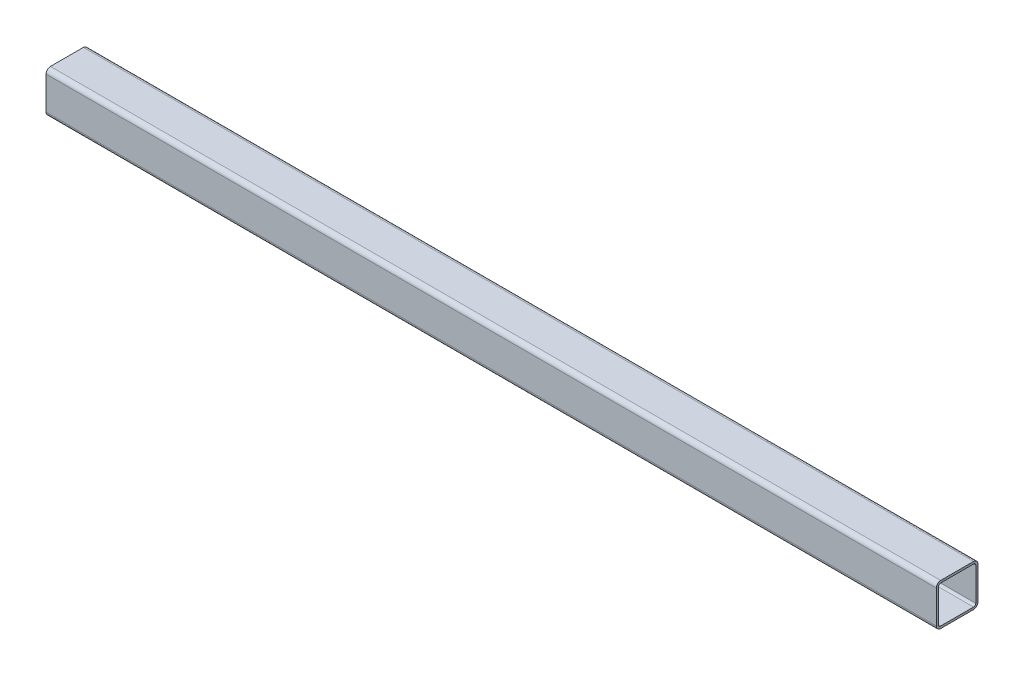
ISO-10303-21;
HEADER;
FILE_DESCRIPTION(('STEP AP214'),'2;1');
FILE_NAME('part.step','',(''),(''),'','','');
FILE_SCHEMA(('AUTOMOTIVE_DESIGN { 1 0 10303 214 1 1 1 1 }'));
ENDSEC;
DATA;
#1=APPLICATION_CONTEXT('core data for automotive mechanical design processes');
#2=APPLICATION_PROTOCOL_DEFINITION('international standard','automotive_design',2000,#1);
#3=PRODUCT_CONTEXT('',#1,'mechanical');
#4=PRODUCT('Part','Part','',(#3));
#5=PRODUCT_RELATED_PRODUCT_CATEGORY('part','',(#4));
#6=PRODUCT_DEFINITION_FORMATION('','',#4);
#7=PRODUCT_DEFINITION_CONTEXT('part definition',#1,'design');
#8=PRODUCT_DEFINITION('design','',#6,#7);
#9=PRODUCT_DEFINITION_SHAPE('','',#8);
#10=(LENGTH_UNIT() NAMED_UNIT(*) SI_UNIT(.MILLI.,.METRE.));
#11=(NAMED_UNIT(*) PLANE_ANGLE_UNIT() SI_UNIT($,.RADIAN.));
#12=(NAMED_UNIT(*) SI_UNIT($,.STERADIAN.) SOLID_ANGLE_UNIT());
#13=UNCERTAINTY_MEASURE_WITH_UNIT(LENGTH_MEASURE(1.E-05),#10,'distance_accuracy_value','');
#14=(GEOMETRIC_REPRESENTATION_CONTEXT(3) GLOBAL_UNCERTAINTY_ASSIGNED_CONTEXT((#13)) GLOBAL_UNIT_ASSIGNED_CONTEXT((#10,
#11,#12)) REPRESENTATION_CONTEXT('',''));
#15=CARTESIAN_POINT('',(0.,0.,0.));
#16=DIRECTION('',(0.,0.,1.));
#17=DIRECTION('',(1.,0.,0.));
#18=AXIS2_PLACEMENT_3D('',#15,#16,#17);
#19=CARTESIAN_POINT('',(670.,276.4,23.6));
#20=DIRECTION('',(-1.,0.,0.));
#21=DIRECTION('',(0.,-1.,0.));
#22=AXIS2_PLACEMENT_3D('',#19,#20,#21);
#23=CYLINDRICAL_SURFACE('',#22,3.19999999999993);
#24=CARTESIAN_POINT('',(-640.,276.4,23.6));
#25=DIRECTION('',(-1.,0.,0.));
#26=DIRECTION('',(0.,-1.,0.));
#27=AXIS2_PLACEMENT_3D('',#24,#25,#26);
#28=CIRCLE('',#27,3.19999999999993);
#29=CARTESIAN_POINT('',(-640.,276.4,26.7999999999999));
#30=VERTEX_POINT('',#29);
#31=CARTESIAN_POINT('',(-640.,273.2,23.6));
#32=VERTEX_POINT('',#31);
#33=EDGE_CURVE('E197',#30,#32,#28,.F.);
#34=ORIENTED_EDGE('',*,*,#33,.F.);
#35=DIRECTION('',(1.,0.,0.));
#36=VECTOR('',#35,1.);
#37=CARTESIAN_POINT('',(670.,276.4,26.7999999999999));
#38=LINE('',#37,#36);
#39=CARTESIAN_POINT('',(640.,276.4,26.7999999999999));
#40=VERTEX_POINT('',#39);
#41=EDGE_CURVE('E163',#40,#30,#38,.F.);
#42=ORIENTED_EDGE('',*,*,#41,.F.);
#43=CARTESIAN_POINT('',(640.,276.4,23.6));
#44=DIRECTION('',(-1.,0.,0.));
#45=DIRECTION('',(0.,-1.,0.));
#46=AXIS2_PLACEMENT_3D('',#43,#44,#45);
#47=CIRCLE('',#46,3.19999999999993);
#48=CARTESIAN_POINT('',(640.,273.2,23.6));
#49=VERTEX_POINT('',#48);
#50=EDGE_CURVE('E213',#49,#40,#47,.T.);
#51=ORIENTED_EDGE('',*,*,#50,.F.);
#52=DIRECTION('',(1.,0.,0.));
#53=VECTOR('',#52,1.);
#54=CARTESIAN_POINT('',(670.,273.2,23.6));
#55=LINE('',#54,#53);
#56=EDGE_CURVE('E173',#32,#49,#55,.T.);
#57=ORIENTED_EDGE('',*,*,#56,.F.);
#58=EDGE_LOOP('',(#34,#42,#51,#57));
#59=FACE_BOUND('',#58,.T.);
#60=ADVANCED_FACE('F16',(#59),#23,.F.);
#61=CARTESIAN_POINT('',(670.,273.2,23.6));
#62=DIRECTION('',(0.,1.,0.));
#63=DIRECTION('',(0.,0.,1.));
#64=AXIS2_PLACEMENT_3D('',#61,#62,#63);
#65=PLANE('',#64);
#66=ORIENTED_EDGE('',*,*,#56,.T.);
#67=DIRECTION('',(0.,0.,-1.));
#68=VECTOR('',#67,1.);
#69=CARTESIAN_POINT('',(640.,273.2,1170.));
#70=LINE('',#69,#68);
#71=CARTESIAN_POINT('',(640.,273.2,-23.6));
#72=VERTEX_POINT('',#71);
#73=EDGE_CURVE('E139',#72,#49,#70,.F.);
#74=ORIENTED_EDGE('',*,*,#73,.F.);
#75=DIRECTION('',(-1.,0.,0.));
#76=VECTOR('',#75,1.);
#77=CARTESIAN_POINT('',(670.,273.2,-23.6));
#78=LINE('',#77,#76);
#79=CARTESIAN_POINT('',(-640.,273.2,-23.6));
#80=VERTEX_POINT('',#79);
#81=EDGE_CURVE('E170',#72,#80,#78,.T.);
#82=ORIENTED_EDGE('',*,*,#81,.T.);
#83=DIRECTION('',(0.,0.,1.));
#84=VECTOR('',#83,1.);
#85=CARTESIAN_POINT('',(-640.,273.2,1170.));
#86=LINE('',#85,#84);
#87=EDGE_CURVE('E196',#32,#80,#86,.F.);
#88=ORIENTED_EDGE('',*,*,#87,.F.);
#89=EDGE_LOOP('',(#66,#74,#82,#88));
#90=FACE_BOUND('',#89,.T.);
#91=ADVANCED_FACE('F435',(#90),#65,.T.);
#92=CARTESIAN_POINT('',(670.,276.4,-23.6));
#93=DIRECTION('',(-1.,0.,0.));
#94=DIRECTION('',(0.,-1.,0.));
#95=AXIS2_PLACEMENT_3D('',#92,#93,#94);
#96=CYLINDRICAL_SURFACE('',#95,3.19999999999998);
#97=CARTESIAN_POINT('',(-640.,276.4,-23.6));
#98=DIRECTION('',(-1.,0.,0.));
#99=DIRECTION('',(0.,-1.,0.));
#100=AXIS2_PLACEMENT_3D('',#97,#98,#99);
#101=CIRCLE('',#100,3.19999999999998);
#102=CARTESIAN_POINT('',(-640.,276.4,-26.8000000000001));
#103=VERTEX_POINT('',#102);
#104=EDGE_CURVE('E194',#80,#103,#101,.F.);
#105=ORIENTED_EDGE('',*,*,#104,.F.);
#106=ORIENTED_EDGE('',*,*,#81,.F.);
#107=CARTESIAN_POINT('',(640.,276.4,-23.6));
#108=DIRECTION('',(-1.,0.,0.));
#109=DIRECTION('',(0.,-1.,0.));
#110=AXIS2_PLACEMENT_3D('',#107,#108,#109);
#111=CIRCLE('',#110,3.19999999999998);
#112=CARTESIAN_POINT('',(640.,276.4,-26.8000000000001));
#113=VERTEX_POINT('',#112);
#114=EDGE_CURVE('E137',#113,#72,#111,.T.);
#115=ORIENTED_EDGE('',*,*,#114,.F.);
#116=DIRECTION('',(1.,0.,0.));
#117=VECTOR('',#116,1.);
#118=CARTESIAN_POINT('',(670.,276.4,-26.8000000000001));
#119=LINE('',#118,#117);
#120=EDGE_CURVE('E124',#103,#113,#119,.T.);
#121=ORIENTED_EDGE('',*,*,#120,.F.);
#122=EDGE_LOOP('',(#105,#106,#115,#121));
#123=FACE_BOUND('',#122,.T.);
#124=ADVANCED_FACE('F426',(#123),#96,.F.);
#125=CARTESIAN_POINT('',(670.,323.6,-26.8));
#126=DIRECTION('',(0.,0.,1.));
#127=DIRECTION('',(0.,-1.,0.));
#128=AXIS2_PLACEMENT_3D('',#125,#126,#127);
#129=PLANE('',#128);
#130=ORIENTED_EDGE('',*,*,#120,.T.);
#131=DIRECTION('',(0.,1.,0.));
#132=VECTOR('',#131,1.);
#133=CARTESIAN_POINT('',(640.,276.4,-26.8000000000002));
#134=LINE('',#133,#132);
#135=CARTESIAN_POINT('',(640.,323.6,-26.8));
#136=VERTEX_POINT('',#135);
#137=EDGE_CURVE('E131',#136,#113,#134,.F.);
#138=ORIENTED_EDGE('',*,*,#137,.F.);
#139=DIRECTION('',(-1.,0.,0.));
#140=VECTOR('',#139,1.);
#141=CARTESIAN_POINT('',(670.,323.6,-26.7999999999999));
#142=LINE('',#141,#140);
#143=CARTESIAN_POINT('',(-640.,323.6,-26.8));
#144=VERTEX_POINT('',#143);
#145=EDGE_CURVE('E117',#136,#144,#142,.T.);
#146=ORIENTED_EDGE('',*,*,#145,.T.);
#147=DIRECTION('',(0.,1.,0.));
#148=VECTOR('',#147,1.);
#149=CARTESIAN_POINT('',(-640.,323.6,-26.8000000000002));
#150=LINE('',#149,#148);
#151=EDGE_CURVE('E193',#103,#144,#150,.T.);
#152=ORIENTED_EDGE('',*,*,#151,.F.);
#153=EDGE_LOOP('',(#130,#138,#146,#152));
#154=FACE_BOUND('',#153,.T.);
#155=ADVANCED_FACE('F135',(#154),#129,.T.);
#156=CARTESIAN_POINT('',(670.,323.6,-23.6));
#157=DIRECTION('',(-1.,0.,0.));
#158=DIRECTION('',(0.,-1.,0.));
#159=AXIS2_PLACEMENT_3D('',#156,#157,#158);
#160=CYLINDRICAL_SURFACE('',#159,3.19999999999998);
#161=CARTESIAN_POINT('',(-640.,323.6,-23.6));
#162=DIRECTION('',(-1.,0.,0.));
#163=DIRECTION('',(0.,-1.,0.));
#164=AXIS2_PLACEMENT_3D('',#161,#162,#163);
#165=CIRCLE('',#164,3.19999999999998);
#166=CARTESIAN_POINT('',(-640.,326.8,-23.6));
#167=VERTEX_POINT('',#166);
#168=EDGE_CURVE('E120',#144,#167,#165,.F.);
#169=ORIENTED_EDGE('',*,*,#168,.F.);
#170=ORIENTED_EDGE('',*,*,#145,.F.);
#171=CARTESIAN_POINT('',(640.,323.6,-23.6));
#172=DIRECTION('',(-1.,0.,0.));
#173=DIRECTION('',(0.,-1.,0.));
#174=AXIS2_PLACEMENT_3D('',#171,#172,#173);
#175=CIRCLE('',#174,3.19999999999998);
#176=CARTESIAN_POINT('',(640.,326.8,-23.6));
#177=VERTEX_POINT('',#176);
#178=EDGE_CURVE('E19',#177,#136,#175,.T.);
#179=ORIENTED_EDGE('',*,*,#178,.F.);
#180=DIRECTION('',(1.,0.,0.));
#181=VECTOR('',#180,1.);
#182=CARTESIAN_POINT('',(670.,326.8,-23.6));
#183=LINE('',#182,#181);
#184=EDGE_CURVE('E110',#167,#177,#183,.T.);
#185=ORIENTED_EDGE('',*,*,#184,.F.);
#186=EDGE_LOOP('',(#169,#170,#179,#185));
#187=FACE_BOUND('',#186,.T.);
#188=ADVANCED_FACE('F119',(#187),#160,.F.);
#189=CARTESIAN_POINT('',(670.,326.8,-23.6));
#190=DIRECTION('',(0.,-1.,0.));
#191=DIRECTION('',(0.,0.,-1.));
#192=AXIS2_PLACEMENT_3D('',#189,#190,#191);
#193=PLANE('',#192);
#194=ORIENTED_EDGE('',*,*,#184,.T.);
#195=DIRECTION('',(0.,0.,-1.));
#196=VECTOR('',#195,1.);
#197=CARTESIAN_POINT('',(640.,326.8,1170.));
#198=LINE('',#197,#196);
#199=CARTESIAN_POINT('',(640.,326.8,23.6));
#200=VERTEX_POINT('',#199);
#201=EDGE_CURVE('E134',#200,#177,#198,.T.);
#202=ORIENTED_EDGE('',*,*,#201,.F.);
#203=DIRECTION('',(-1.,0.,0.));
#204=VECTOR('',#203,1.);
#205=CARTESIAN_POINT('',(670.,326.8,23.6));
#206=LINE('',#205,#204);
#207=CARTESIAN_POINT('',(-640.,326.8,23.6));
#208=VERTEX_POINT('',#207);
#209=EDGE_CURVE('E165',#200,#208,#206,.T.);
#210=ORIENTED_EDGE('',*,*,#209,.T.);
#211=DIRECTION('',(0.,0.,1.));
#212=VECTOR('',#211,1.);
#213=CARTESIAN_POINT('',(-640.,326.8,1170.));
#214=LINE('',#213,#212);
#215=EDGE_CURVE('E191',#167,#208,#214,.T.);
#216=ORIENTED_EDGE('',*,*,#215,.F.);
#217=EDGE_LOOP('',(#194,#202,#210,#216));
#218=FACE_BOUND('',#217,.T.);
#219=ADVANCED_FACE('F233',(#218),#193,.T.);
#220=CARTESIAN_POINT('',(670.,323.6,23.6));
#221=DIRECTION('',(-1.,0.,0.));
#222=DIRECTION('',(0.,-1.,0.));
#223=AXIS2_PLACEMENT_3D('',#220,#221,#222);
#224=CYLINDRICAL_SURFACE('',#223,3.19999999999998);
#225=CARTESIAN_POINT('',(-640.,323.6,23.6));
#226=DIRECTION('',(-1.,0.,0.));
#227=DIRECTION('',(0.,-1.,0.));
#228=AXIS2_PLACEMENT_3D('',#225,#226,#227);
#229=CIRCLE('',#228,3.19999999999998);
#230=CARTESIAN_POINT('',(-640.,323.6,26.8));
#231=VERTEX_POINT('',#230);
#232=EDGE_CURVE('E189',#208,#231,#229,.F.);
#233=ORIENTED_EDGE('',*,*,#232,.F.);
#234=ORIENTED_EDGE('',*,*,#209,.F.);
#235=CARTESIAN_POINT('',(640.,323.6,23.6));
#236=DIRECTION('',(-1.,0.,0.));
#237=DIRECTION('',(0.,-1.,0.));
#238=AXIS2_PLACEMENT_3D('',#235,#236,#237);
#239=CIRCLE('',#238,3.19999999999998);
#240=CARTESIAN_POINT('',(640.,323.6,26.8));
#241=VERTEX_POINT('',#240);
#242=EDGE_CURVE('E210',#241,#200,#239,.T.);
#243=ORIENTED_EDGE('',*,*,#242,.F.);
#244=DIRECTION('',(1.,0.,0.));
#245=VECTOR('',#244,1.);
#246=CARTESIAN_POINT('',(670.,323.6,26.8000000000001));
#247=LINE('',#246,#245);
#248=EDGE_CURVE('E155',#231,#241,#247,.T.);
#249=ORIENTED_EDGE('',*,*,#248,.F.);
#250=EDGE_LOOP('',(#233,#234,#243,#249));
#251=FACE_BOUND('',#250,.T.);
#252=ADVANCED_FACE('F232',(#251),#224,.F.);
#253=CARTESIAN_POINT('',(670.,276.4,26.7999999999999));
#254=DIRECTION('',(0.,0.,-1.));
#255=DIRECTION('',(0.,1.,0.));
#256=AXIS2_PLACEMENT_3D('',#253,#254,#255);
#257=PLANE('',#256);
#258=ORIENTED_EDGE('',*,*,#248,.T.);
#259=DIRECTION('',(0.,1.,0.));
#260=VECTOR('',#259,1.);
#261=CARTESIAN_POINT('',(640.,276.4,26.7999999999999));
#262=LINE('',#261,#260);
#263=EDGE_CURVE('E212',#40,#241,#262,.T.);
#264=ORIENTED_EDGE('',*,*,#263,.F.);
#265=ORIENTED_EDGE('',*,*,#41,.T.);
#266=DIRECTION('',(0.,1.,0.));
#267=VECTOR('',#266,1.);
#268=CARTESIAN_POINT('',(-640.,323.6,26.7999999999999));
#269=LINE('',#268,#267);
#270=EDGE_CURVE('E188',#231,#30,#269,.F.);
#271=ORIENTED_EDGE('',*,*,#270,.F.);
#272=EDGE_LOOP('',(#258,#264,#265,#271));
#273=FACE_BOUND('',#272,.T.);
#274=ADVANCED_FACE('F227',(#273),#257,.T.);
#275=CARTESIAN_POINT('',(670.,330.,-23.6));
#276=DIRECTION('',(0.,-1.,0.));
#277=DIRECTION('',(0.,0.,-1.));
#278=AXIS2_PLACEMENT_3D('',#275,#276,#277);
#279=PLANE('',#278);
#280=DIRECTION('',(-1.,0.,0.));
#281=VECTOR('',#280,1.);
#282=CARTESIAN_POINT('',(670.,330.,23.6));
#283=LINE('',#282,#281);
#284=CARTESIAN_POINT('',(640.,330.,23.6));
#285=VERTEX_POINT('',#284);
#286=CARTESIAN_POINT('',(-640.,330.,23.6));
#287=VERTEX_POINT('',#286);
#288=EDGE_CURVE('E144',#285,#287,#283,.T.);
#289=ORIENTED_EDGE('',*,*,#288,.F.);
#290=DIRECTION('',(0.,0.,-1.));
#291=VECTOR('',#290,1.);
#292=CARTESIAN_POINT('',(640.,330.,1170.));
#293=LINE('',#292,#291);
#294=CARTESIAN_POINT('',(640.,330.,-23.6));
#295=VERTEX_POINT('',#294);
#296=EDGE_CURVE('E161',#295,#285,#293,.F.);
#297=ORIENTED_EDGE('',*,*,#296,.F.);
#298=DIRECTION('',(-1.,0.,0.));
#299=VECTOR('',#298,1.);
#300=CARTESIAN_POINT('',(670.,330.,-23.6));
#301=LINE('',#300,#299);
#302=CARTESIAN_POINT('',(-640.,330.,-23.6));
#303=VERTEX_POINT('',#302);
#304=EDGE_CURVE('E153',#303,#295,#301,.F.);
#305=ORIENTED_EDGE('',*,*,#304,.F.);
#306=DIRECTION('',(0.,0.,1.));
#307=VECTOR('',#306,1.);
#308=CARTESIAN_POINT('',(-640.,330.,1170.));
#309=LINE('',#308,#307);
#310=EDGE_CURVE('E183',#287,#303,#309,.F.);
#311=ORIENTED_EDGE('',*,*,#310,.F.);
#312=EDGE_LOOP('',(#289,#297,#305,#311));
#313=FACE_BOUND('',#312,.T.);
#314=ADVANCED_FACE('F299',(#313),#279,.F.);
#315=CARTESIAN_POINT('',(670.,323.6,-23.6));
#316=DIRECTION('',(-1.,0.,0.));
#317=DIRECTION('',(0.,-1.,0.));
#318=AXIS2_PLACEMENT_3D('',#315,#316,#317);
#319=CYLINDRICAL_SURFACE('',#318,6.40000000000002);
#320=CARTESIAN_POINT('',(640.,323.6,-23.6));
#321=DIRECTION('',(-1.,0.,0.));
#322=DIRECTION('',(0.,-1.,0.));
#323=AXIS2_PLACEMENT_3D('',#320,#321,#322);
#324=CIRCLE('',#323,6.40000000000002);
#325=CARTESIAN_POINT('',(640.,323.6,-30.));
#326=VERTEX_POINT('',#325);
#327=EDGE_CURVE('E200',#326,#295,#324,.F.);
#328=ORIENTED_EDGE('',*,*,#327,.F.);
#329=DIRECTION('',(1.,0.,0.));
#330=VECTOR('',#329,1.);
#331=CARTESIAN_POINT('',(670.,323.6,-30.));
#332=LINE('',#331,#330);
#333=CARTESIAN_POINT('',(-640.,323.6,-30.));
#334=VERTEX_POINT('',#333);
#335=EDGE_CURVE('E150',#326,#334,#332,.F.);
#336=ORIENTED_EDGE('',*,*,#335,.T.);
#337=CARTESIAN_POINT('',(-640.,323.6,-23.6));
#338=DIRECTION('',(-1.,0.,0.));
#339=DIRECTION('',(0.,-1.,0.));
#340=AXIS2_PLACEMENT_3D('',#337,#338,#339);
#341=CIRCLE('',#340,6.40000000000002);
#342=EDGE_CURVE('E180',#303,#334,#341,.T.);
#343=ORIENTED_EDGE('',*,*,#342,.F.);
#344=ORIENTED_EDGE('',*,*,#304,.T.);
#345=EDGE_LOOP('',(#328,#336,#343,#344));
#346=FACE_BOUND('',#345,.T.);
#347=ADVANCED_FACE('F304',(#346),#319,.T.);
#348=CARTESIAN_POINT('',(670.,323.6,-30.));
#349=DIRECTION('',(0.,0.,1.));
#350=DIRECTION('',(0.,-1.,0.));
#351=AXIS2_PLACEMENT_3D('',#348,#349,#350);
#352=PLANE('',#351);
#353=ORIENTED_EDGE('',*,*,#335,.F.);
#354=DIRECTION('',(0.,1.,0.));
#355=VECTOR('',#354,1.);
#356=CARTESIAN_POINT('',(640.,276.4,-30.));
#357=LINE('',#356,#355);
#358=CARTESIAN_POINT('',(640.,276.4,-30.));
#359=VERTEX_POINT('',#358);
#360=EDGE_CURVE('E203',#359,#326,#357,.T.);
#361=ORIENTED_EDGE('',*,*,#360,.F.);
#362=DIRECTION('',(-1.,0.,0.));
#363=VECTOR('',#362,1.);
#364=CARTESIAN_POINT('',(670.,276.4,-30.));
#365=LINE('',#364,#363);
#366=CARTESIAN_POINT('',(-640.,276.4,-30.));
#367=VERTEX_POINT('',#366);
#368=EDGE_CURVE('E148',#367,#359,#365,.F.);
#369=ORIENTED_EDGE('',*,*,#368,.F.);
#370=DIRECTION('',(0.,1.,0.));
#371=VECTOR('',#370,1.);
#372=CARTESIAN_POINT('',(-640.,323.6,-30.));
#373=LINE('',#372,#371);
#374=EDGE_CURVE('E179',#334,#367,#373,.F.);
#375=ORIENTED_EDGE('',*,*,#374,.F.);
#376=EDGE_LOOP('',(#353,#361,#369,#375));
#377=FACE_BOUND('',#376,.T.);
#378=ADVANCED_FACE('F270',(#377),#352,.F.);
#379=CARTESIAN_POINT('',(670.,276.4,-23.6));
#380=DIRECTION('',(-1.,0.,0.));
#381=DIRECTION('',(0.,-1.,0.));
#382=AXIS2_PLACEMENT_3D('',#379,#380,#381);
#383=CYLINDRICAL_SURFACE('',#382,6.40000000000002);
#384=CARTESIAN_POINT('',(640.,276.4,-23.6));
#385=DIRECTION('',(-1.,0.,0.));
#386=DIRECTION('',(0.,-1.,0.));
#387=AXIS2_PLACEMENT_3D('',#384,#385,#386);
#388=CIRCLE('',#387,6.40000000000002);
#389=CARTESIAN_POINT('',(640.,270.,-23.6));
#390=VERTEX_POINT('',#389);
#391=EDGE_CURVE('E204',#390,#359,#388,.F.);
#392=ORIENTED_EDGE('',*,*,#391,.F.);
#393=DIRECTION('',(1.,0.,0.));
#394=VECTOR('',#393,1.);
#395=CARTESIAN_POINT('',(670.,270.,-23.6));
#396=LINE('',#395,#394);
#397=CARTESIAN_POINT('',(-640.,270.,-23.6));
#398=VERTEX_POINT('',#397);
#399=EDGE_CURVE('E145',#390,#398,#396,.F.);
#400=ORIENTED_EDGE('',*,*,#399,.T.);
#401=CARTESIAN_POINT('',(-640.,276.4,-23.6));
#402=DIRECTION('',(-1.,0.,0.));
#403=DIRECTION('',(0.,-1.,0.));
#404=AXIS2_PLACEMENT_3D('',#401,#402,#403);
#405=CIRCLE('',#404,6.40000000000002);
#406=EDGE_CURVE('E175',#367,#398,#405,.T.);
#407=ORIENTED_EDGE('',*,*,#406,.F.);
#408=ORIENTED_EDGE('',*,*,#368,.T.);
#409=EDGE_LOOP('',(#392,#400,#407,#408));
#410=FACE_BOUND('',#409,.T.);
#411=ADVANCED_FACE('F262',(#410),#383,.T.);
#412=CARTESIAN_POINT('',(670.,270.,23.6));
#413=DIRECTION('',(0.,1.,0.));
#414=DIRECTION('',(0.,0.,1.));
#415=AXIS2_PLACEMENT_3D('',#412,#413,#414);
#416=PLANE('',#415);
#417=ORIENTED_EDGE('',*,*,#399,.F.);
#418=DIRECTION('',(0.,0.,-1.));
#419=VECTOR('',#418,1.);
#420=CARTESIAN_POINT('',(640.,270.,1170.));
#421=LINE('',#420,#419);
#422=CARTESIAN_POINT('',(640.,270.,23.6));
#423=VERTEX_POINT('',#422);
#424=EDGE_CURVE('E207',#423,#390,#421,.T.);
#425=ORIENTED_EDGE('',*,*,#424,.F.);
#426=DIRECTION('',(-1.,0.,0.));
#427=VECTOR('',#426,1.);
#428=CARTESIAN_POINT('',(670.,270.,23.6));
#429=LINE('',#428,#427);
#430=CARTESIAN_POINT('',(-640.,270.,23.6));
#431=VERTEX_POINT('',#430);
#432=EDGE_CURVE('E158',#431,#423,#429,.F.);
#433=ORIENTED_EDGE('',*,*,#432,.F.);
#434=DIRECTION('',(0.,0.,1.));
#435=VECTOR('',#434,1.);
#436=CARTESIAN_POINT('',(-640.,270.,1170.));
#437=LINE('',#436,#435);
#438=EDGE_CURVE('E178',#398,#431,#437,.T.);
#439=ORIENTED_EDGE('',*,*,#438,.F.);
#440=EDGE_LOOP('',(#417,#425,#433,#439));
#441=FACE_BOUND('',#440,.T.);
#442=ADVANCED_FACE('F285',(#441),#416,.F.);
#443=CARTESIAN_POINT('',(670.,323.6,23.6));
#444=DIRECTION('',(-1.,0.,0.));
#445=DIRECTION('',(0.,-1.,0.));
#446=AXIS2_PLACEMENT_3D('',#443,#444,#445);
#447=CYLINDRICAL_SURFACE('',#446,6.40000000000002);
#448=CARTESIAN_POINT('',(640.,323.6,23.6));
#449=DIRECTION('',(-1.,0.,0.));
#450=DIRECTION('',(0.,-1.,0.));
#451=AXIS2_PLACEMENT_3D('',#448,#449,#450);
#452=CIRCLE('',#451,6.40000000000002);
#453=CARTESIAN_POINT('',(640.,323.6,30.));
#454=VERTEX_POINT('',#453);
#455=EDGE_CURVE('E208',#285,#454,#452,.F.);
#456=ORIENTED_EDGE('',*,*,#455,.F.);
#457=ORIENTED_EDGE('',*,*,#288,.T.);
#458=CARTESIAN_POINT('',(-640.,323.6,23.6));
#459=DIRECTION('',(-1.,0.,0.));
#460=DIRECTION('',(0.,-1.,0.));
#461=AXIS2_PLACEMENT_3D('',#458,#459,#460);
#462=CIRCLE('',#461,6.40000000000002);
#463=CARTESIAN_POINT('',(-640.,323.6,30.));
#464=VERTEX_POINT('',#463);
#465=EDGE_CURVE('E184',#464,#287,#462,.T.);
#466=ORIENTED_EDGE('',*,*,#465,.F.);
#467=DIRECTION('',(1.,0.,0.));
#468=VECTOR('',#467,1.);
#469=CARTESIAN_POINT('',(670.,323.6,30.));
#470=LINE('',#469,#468);
#471=EDGE_CURVE('E244',#464,#454,#470,.T.);
#472=ORIENTED_EDGE('',*,*,#471,.T.);
#473=EDGE_LOOP('',(#456,#457,#466,#472));
#474=FACE_BOUND('',#473,.T.);
#475=ADVANCED_FACE('F295',(#474),#447,.T.);
#476=CARTESIAN_POINT('',(640.,276.4,1170.));
#477=DIRECTION('',(1.,0.,0.));
#478=DIRECTION('',(0.,0.,-1.));
#479=AXIS2_PLACEMENT_3D('',#476,#477,#478);
#480=PLANE('',#479);
#481=ORIENTED_EDGE('',*,*,#327,.T.);
#482=ORIENTED_EDGE('',*,*,#296,.T.);
#483=ORIENTED_EDGE('',*,*,#455,.T.);
#484=DIRECTION('',(0.,1.,0.));
#485=VECTOR('',#484,1.);
#486=CARTESIAN_POINT('',(640.,276.4,30.));
#487=LINE('',#486,#485);
#488=CARTESIAN_POINT('',(640.,276.4,30.));
#489=VERTEX_POINT('',#488);
#490=EDGE_CURVE('E242',#454,#489,#487,.F.);
#491=ORIENTED_EDGE('',*,*,#490,.T.);
#492=CARTESIAN_POINT('',(640.,276.4,23.6));
#493=DIRECTION('',(-1.,0.,0.));
#494=DIRECTION('',(0.,-1.,0.));
#495=AXIS2_PLACEMENT_3D('',#492,#493,#494);
#496=CIRCLE('',#495,6.40000000000002);
#497=EDGE_CURVE('E160',#423,#489,#496,.T.);
#498=ORIENTED_EDGE('',*,*,#497,.F.);
#499=ORIENTED_EDGE('',*,*,#424,.T.);
#500=ORIENTED_EDGE('',*,*,#391,.T.);
#501=ORIENTED_EDGE('',*,*,#360,.T.);
#502=EDGE_LOOP('',(#481,#482,#483,#491,#498,#499,#500,#501));
#503=FACE_BOUND('',#502,.T.);
#504=ORIENTED_EDGE('',*,*,#263,.T.);
#505=ORIENTED_EDGE('',*,*,#242,.T.);
#506=ORIENTED_EDGE('',*,*,#201,.T.);
#507=ORIENTED_EDGE('',*,*,#178,.T.);
#508=ORIENTED_EDGE('',*,*,#137,.T.);
#509=ORIENTED_EDGE('',*,*,#114,.T.);
#510=ORIENTED_EDGE('',*,*,#73,.T.);
#511=ORIENTED_EDGE('',*,*,#50,.T.);
#512=EDGE_LOOP('',(#504,#505,#506,#507,#508,#509,#510,#511));
#513=FACE_BOUND('',#512,.T.);
#514=ADVANCED_FACE('F129',(#503,#513),#480,.T.);
#515=CARTESIAN_POINT('',(670.,276.4,23.6));
#516=DIRECTION('',(-1.,0.,0.));
#517=DIRECTION('',(0.,-1.,0.));
#518=AXIS2_PLACEMENT_3D('',#515,#516,#517);
#519=CYLINDRICAL_SURFACE('',#518,6.40000000000002);
#520=ORIENTED_EDGE('',*,*,#497,.T.);
#521=DIRECTION('',(1.,0.,0.));
#522=VECTOR('',#521,1.);
#523=CARTESIAN_POINT('',(670.,276.4,30.));
#524=LINE('',#523,#522);
#525=CARTESIAN_POINT('',(-640.,276.4,30.));
#526=VERTEX_POINT('',#525);
#527=EDGE_CURVE('E25',#489,#526,#524,.F.);
#528=ORIENTED_EDGE('',*,*,#527,.T.);
#529=CARTESIAN_POINT('',(-640.,276.4,23.6));
#530=DIRECTION('',(-1.,0.,0.));
#531=DIRECTION('',(0.,-1.,0.));
#532=AXIS2_PLACEMENT_3D('',#529,#530,#531);
#533=CIRCLE('',#532,6.40000000000002);
#534=EDGE_CURVE('E33',#431,#526,#533,.T.);
#535=ORIENTED_EDGE('',*,*,#534,.F.);
#536=ORIENTED_EDGE('',*,*,#432,.T.);
#537=EDGE_LOOP('',(#520,#528,#535,#536));
#538=FACE_BOUND('',#537,.T.);
#539=ADVANCED_FACE('F289',(#538),#519,.T.);
#540=CARTESIAN_POINT('',(-640.,323.6,1170.));
#541=DIRECTION('',(-1.,0.,0.));
#542=DIRECTION('',(0.,0.,1.));
#543=AXIS2_PLACEMENT_3D('',#540,#541,#542);
#544=PLANE('',#543);
#545=ORIENTED_EDGE('',*,*,#406,.T.);
#546=ORIENTED_EDGE('',*,*,#438,.T.);
#547=ORIENTED_EDGE('',*,*,#534,.T.);
#548=DIRECTION('',(0.,1.,0.));
#549=VECTOR('',#548,1.);
#550=CARTESIAN_POINT('',(-640.,276.4,30.));
#551=LINE('',#550,#549);
#552=EDGE_CURVE('E11',#526,#464,#551,.T.);
#553=ORIENTED_EDGE('',*,*,#552,.T.);
#554=ORIENTED_EDGE('',*,*,#465,.T.);
#555=ORIENTED_EDGE('',*,*,#310,.T.);
#556=ORIENTED_EDGE('',*,*,#342,.T.);
#557=ORIENTED_EDGE('',*,*,#374,.T.);
#558=EDGE_LOOP('',(#545,#546,#547,#553,#554,#555,#556,#557));
#559=FACE_BOUND('',#558,.T.);
#560=ORIENTED_EDGE('',*,*,#232,.T.);
#561=ORIENTED_EDGE('',*,*,#270,.T.);
#562=ORIENTED_EDGE('',*,*,#33,.T.);
#563=ORIENTED_EDGE('',*,*,#87,.T.);
#564=ORIENTED_EDGE('',*,*,#104,.T.);
#565=ORIENTED_EDGE('',*,*,#151,.T.);
#566=ORIENTED_EDGE('',*,*,#168,.T.);
#567=ORIENTED_EDGE('',*,*,#215,.T.);
#568=EDGE_LOOP('',(#560,#561,#562,#563,#564,#565,#566,#567));
#569=FACE_BOUND('',#568,.T.);
#570=ADVANCED_FACE('F287',(#559,#569),#544,.T.);
#571=CARTESIAN_POINT('',(670.,276.4,30.));
#572=DIRECTION('',(0.,0.,-1.));
#573=DIRECTION('',(0.,1.,0.));
#574=AXIS2_PLACEMENT_3D('',#571,#572,#573);
#575=PLANE('',#574);
#576=ORIENTED_EDGE('',*,*,#527,.F.);
#577=ORIENTED_EDGE('',*,*,#490,.F.);
#578=ORIENTED_EDGE('',*,*,#471,.F.);
#579=ORIENTED_EDGE('',*,*,#552,.F.);
#580=EDGE_LOOP('',(#576,#577,#578,#579));
#581=FACE_BOUND('',#580,.T.);
#582=ADVANCED_FACE('F293',(#581),#575,.F.);
#583=CLOSED_SHELL('',(#60,#91,#124,#155,#188,#219,#252,#274,#314,#347,#378,#411,#442,#475,#514,
#539,#570,#582));
#584=MANIFOLD_SOLID_BREP('B1',#583);
#585=ADVANCED_BREP_SHAPE_REPRESENTATION('',(#18,#584),#14);
#586=SHAPE_DEFINITION_REPRESENTATION(#9,#585);
ENDSEC;
END-ISO-10303-21;
